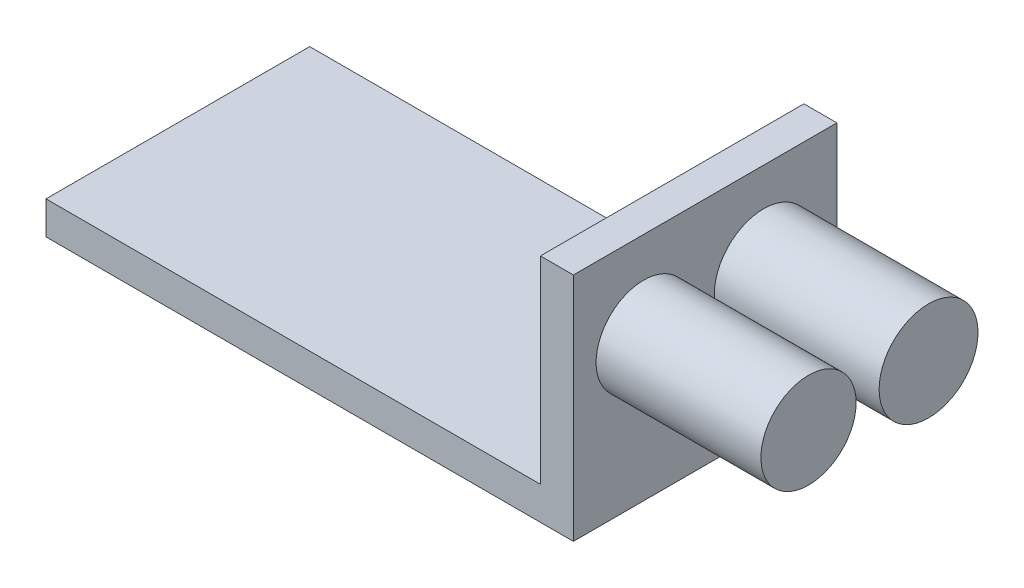
ISO-10303-21;
HEADER;
FILE_DESCRIPTION(('STEP AP214'),'2;1');
FILE_NAME('part.step','',(''),(''),'','','');
FILE_SCHEMA(('AUTOMOTIVE_DESIGN { 1 0 10303 214 1 1 1 1 }'));
ENDSEC;
DATA;
#1=APPLICATION_CONTEXT('core data for automotive mechanical design processes');
#2=APPLICATION_PROTOCOL_DEFINITION('international standard','automotive_design',2000,#1);
#3=PRODUCT_CONTEXT('',#1,'mechanical');
#4=PRODUCT('Part','Part','',(#3));
#5=PRODUCT_RELATED_PRODUCT_CATEGORY('part','',(#4));
#6=PRODUCT_DEFINITION_FORMATION('','',#4);
#7=PRODUCT_DEFINITION_CONTEXT('part definition',#1,'design');
#8=PRODUCT_DEFINITION('design','',#6,#7);
#9=PRODUCT_DEFINITION_SHAPE('','',#8);
#10=(LENGTH_UNIT() NAMED_UNIT(*) SI_UNIT(.MILLI.,.METRE.));
#11=(NAMED_UNIT(*) PLANE_ANGLE_UNIT() SI_UNIT($,.RADIAN.));
#12=(NAMED_UNIT(*) SI_UNIT($,.STERADIAN.) SOLID_ANGLE_UNIT());
#13=UNCERTAINTY_MEASURE_WITH_UNIT(LENGTH_MEASURE(1.E-05),#10,'distance_accuracy_value','');
#14=(GEOMETRIC_REPRESENTATION_CONTEXT(3) GLOBAL_UNCERTAINTY_ASSIGNED_CONTEXT((#13)) GLOBAL_UNIT_ASSIGNED_CONTEXT((#10,
#11,#12)) REPRESENTATION_CONTEXT('',''));
#15=CARTESIAN_POINT('',(0.,0.,0.));
#16=DIRECTION('',(0.,0.,1.));
#17=DIRECTION('',(1.,0.,0.));
#18=AXIS2_PLACEMENT_3D('',#15,#16,#17);
#19=CARTESIAN_POINT('',(7.5,1.,4.));
#20=DIRECTION('',(-1.,0.,0.));
#21=DIRECTION('',(0.,0.,1.));
#22=AXIS2_PLACEMENT_3D('',#19,#20,#21);
#23=PLANE('',#22);
#24=DIRECTION('',(0.,1.,0.));
#25=VECTOR('',#24,1.);
#26=CARTESIAN_POINT('',(7.5,0.,-3.99382905658285));
#27=LINE('',#26,#25);
#28=CARTESIAN_POINT('',(7.5,0.,-3.99382905658285));
#29=VERTEX_POINT('',#28);
#30=CARTESIAN_POINT('',(7.5,1.,-3.99382905658285));
#31=VERTEX_POINT('',#30);
#32=EDGE_CURVE('E47',#29,#31,#27,.T.);
#33=ORIENTED_EDGE('',*,*,#32,.F.);
#34=DIRECTION('',(0.,0.,-1.));
#35=VECTOR('',#34,1.);
#36=CARTESIAN_POINT('',(7.5,0.,4.));
#37=LINE('',#36,#35);
#38=CARTESIAN_POINT('',(7.5,0.,-4.));
#39=VERTEX_POINT('',#38);
#40=EDGE_CURVE('E114',#29,#39,#37,.T.);
#41=ORIENTED_EDGE('',*,*,#40,.T.);
#42=DIRECTION('',(0.,-1.,0.));
#43=VECTOR('',#42,1.);
#44=CARTESIAN_POINT('',(7.5,1.,-4.));
#45=LINE('',#44,#43);
#46=CARTESIAN_POINT('',(7.5,1.,-4.));
#47=VERTEX_POINT('',#46);
#48=EDGE_CURVE('E161',#47,#39,#45,.T.);
#49=ORIENTED_EDGE('',*,*,#48,.F.);
#50=DIRECTION('',(0.,0.,-1.));
#51=VECTOR('',#50,1.);
#52=CARTESIAN_POINT('',(7.5,1.,4.));
#53=LINE('',#52,#51);
#54=EDGE_CURVE('E152',#31,#47,#53,.T.);
#55=ORIENTED_EDGE('',*,*,#54,.F.);
#56=EDGE_LOOP('',(#33,#41,#49,#55));
#57=FACE_BOUND('',#56,.T.);
#58=ADVANCED_FACE('F32',(#57),#23,.F.);
#59=CARTESIAN_POINT('',(-7.5,1.,4.));
#60=DIRECTION('',(1.,0.,0.));
#61=DIRECTION('',(0.,0.,-1.));
#62=AXIS2_PLACEMENT_3D('',#59,#60,#61);
#63=PLANE('',#62);
#64=DIRECTION('',(0.,0.,1.));
#65=VECTOR('',#64,1.);
#66=CARTESIAN_POINT('',(-7.5,0.,4.));
#67=LINE('',#66,#65);
#68=CARTESIAN_POINT('',(-7.5,0.,-4.));
#69=VERTEX_POINT('',#68);
#70=CARTESIAN_POINT('',(-7.5,0.,4.));
#71=VERTEX_POINT('',#70);
#72=EDGE_CURVE('E115',#69,#71,#67,.T.);
#73=ORIENTED_EDGE('',*,*,#72,.T.);
#74=DIRECTION('',(0.,-1.,0.));
#75=VECTOR('',#74,1.);
#76=CARTESIAN_POINT('',(-7.5,1.,4.));
#77=LINE('',#76,#75);
#78=CARTESIAN_POINT('',(-7.5,1.,4.));
#79=VERTEX_POINT('',#78);
#80=EDGE_CURVE('E110',#79,#71,#77,.T.);
#81=ORIENTED_EDGE('',*,*,#80,.F.);
#82=DIRECTION('',(0.,0.,1.));
#83=VECTOR('',#82,1.);
#84=CARTESIAN_POINT('',(-7.5,1.,4.));
#85=LINE('',#84,#83);
#86=CARTESIAN_POINT('',(-7.5,1.,-4.));
#87=VERTEX_POINT('',#86);
#88=EDGE_CURVE('E149',#87,#79,#85,.T.);
#89=ORIENTED_EDGE('',*,*,#88,.F.);
#90=DIRECTION('',(0.,-1.,0.));
#91=VECTOR('',#90,1.);
#92=CARTESIAN_POINT('',(-7.5,1.,-4.));
#93=LINE('',#92,#91);
#94=EDGE_CURVE('E156',#87,#69,#93,.T.);
#95=ORIENTED_EDGE('',*,*,#94,.T.);
#96=EDGE_LOOP('',(#73,#81,#89,#95));
#97=FACE_BOUND('',#96,.T.);
#98=ADVANCED_FACE('F34',(#97),#63,.F.);
#99=CARTESIAN_POINT('',(7.5,1.,4.));
#100=DIRECTION('',(0.,0.,-1.));
#101=DIRECTION('',(-1.,0.,0.));
#102=AXIS2_PLACEMENT_3D('',#99,#100,#101);
#103=PLANE('',#102);
#104=DIRECTION('',(1.,0.,0.));
#105=VECTOR('',#104,1.);
#106=CARTESIAN_POINT('',(7.5,0.,4.));
#107=LINE('',#106,#105);
#108=CARTESIAN_POINT('',(8.5,0.,4.));
#109=VERTEX_POINT('',#108);
#110=EDGE_CURVE('E103',#71,#109,#107,.T.);
#111=ORIENTED_EDGE('',*,*,#110,.T.);
#112=DIRECTION('',(0.,-1.,0.));
#113=VECTOR('',#112,1.);
#114=CARTESIAN_POINT('',(8.5,0.,4.));
#115=LINE('',#114,#113);
#116=CARTESIAN_POINT('',(8.5,7.,4.));
#117=VERTEX_POINT('',#116);
#118=EDGE_CURVE('E108',#117,#109,#115,.T.);
#119=ORIENTED_EDGE('',*,*,#118,.F.);
#120=DIRECTION('',(-1.,0.,0.));
#121=VECTOR('',#120,1.);
#122=CARTESIAN_POINT('',(8.5,7.,4.));
#123=LINE('',#122,#121);
#124=CARTESIAN_POINT('',(7.5,7.,4.));
#125=VERTEX_POINT('',#124);
#126=EDGE_CURVE('E138',#117,#125,#123,.T.);
#127=ORIENTED_EDGE('',*,*,#126,.T.);
#128=DIRECTION('',(0.,-1.,0.));
#129=VECTOR('',#128,1.);
#130=CARTESIAN_POINT('',(7.5,0.,4.));
#131=LINE('',#130,#129);
#132=CARTESIAN_POINT('',(7.5,1.,4.));
#133=VERTEX_POINT('',#132);
#134=EDGE_CURVE('E139',#125,#133,#131,.T.);
#135=ORIENTED_EDGE('',*,*,#134,.T.);
#136=DIRECTION('',(1.,0.,0.));
#137=VECTOR('',#136,1.);
#138=CARTESIAN_POINT('',(7.5,1.,4.));
#139=LINE('',#138,#137);
#140=EDGE_CURVE('E81',#79,#133,#139,.T.);
#141=ORIENTED_EDGE('',*,*,#140,.F.);
#142=ORIENTED_EDGE('',*,*,#80,.T.);
#143=EDGE_LOOP('',(#111,#119,#127,#135,#141,#142));
#144=FACE_BOUND('',#143,.T.);
#145=ADVANCED_FACE('F105',(#144),#103,.F.);
#146=CARTESIAN_POINT('',(7.5,1.,-4.));
#147=DIRECTION('',(0.,0.,1.));
#148=DIRECTION('',(1.,0.,0.));
#149=AXIS2_PLACEMENT_3D('',#146,#147,#148);
#150=PLANE('',#149);
#151=DIRECTION('',(-1.,0.,0.));
#152=VECTOR('',#151,1.);
#153=CARTESIAN_POINT('',(7.5,0.,-4.));
#154=LINE('',#153,#152);
#155=EDGE_CURVE('E73',#39,#69,#154,.T.);
#156=ORIENTED_EDGE('',*,*,#155,.T.);
#157=ORIENTED_EDGE('',*,*,#94,.F.);
#158=DIRECTION('',(-1.,0.,0.));
#159=VECTOR('',#158,1.);
#160=CARTESIAN_POINT('',(7.5,1.,-4.));
#161=LINE('',#160,#159);
#162=EDGE_CURVE('E56',#47,#87,#161,.T.);
#163=ORIENTED_EDGE('',*,*,#162,.F.);
#164=ORIENTED_EDGE('',*,*,#48,.T.);
#165=EDGE_LOOP('',(#156,#157,#163,#164));
#166=FACE_BOUND('',#165,.T.);
#167=ADVANCED_FACE('F190',(#166),#150,.F.);
#168=CARTESIAN_POINT('',(0.,1.,0.));
#169=DIRECTION('',(0.,1.,0.));
#170=DIRECTION('',(0.,0.,1.));
#171=AXIS2_PLACEMENT_3D('',#168,#169,#170);
#172=PLANE('',#171);
#173=ORIENTED_EDGE('',*,*,#88,.T.);
#174=ORIENTED_EDGE('',*,*,#140,.T.);
#175=EDGE_CURVE('E153',#133,#31,#53,.T.);
#176=ORIENTED_EDGE('',*,*,#175,.T.);
#177=ORIENTED_EDGE('',*,*,#54,.T.);
#178=ORIENTED_EDGE('',*,*,#162,.T.);
#179=EDGE_LOOP('',(#173,#174,#176,#177,#178));
#180=FACE_BOUND('',#179,.T.);
#181=ADVANCED_FACE('F196',(#180),#172,.T.);
#182=CARTESIAN_POINT('',(0.,0.,0.));
#183=DIRECTION('',(0.,1.,0.));
#184=DIRECTION('',(0.,0.,1.));
#185=AXIS2_PLACEMENT_3D('',#182,#183,#184);
#186=PLANE('',#185);
#187=ORIENTED_EDGE('',*,*,#72,.F.);
#188=ORIENTED_EDGE('',*,*,#155,.F.);
#189=ORIENTED_EDGE('',*,*,#40,.F.);
#190=DIRECTION('',(-1.,0.,0.));
#191=VECTOR('',#190,1.);
#192=CARTESIAN_POINT('',(8.5,0.,-3.99382905658285));
#193=LINE('',#192,#191);
#194=CARTESIAN_POINT('',(8.5,0.,-3.99382905658285));
#195=VERTEX_POINT('',#194);
#196=EDGE_CURVE('E121',#195,#29,#193,.T.);
#197=ORIENTED_EDGE('',*,*,#196,.F.);
#198=DIRECTION('',(0.,0.,-1.));
#199=VECTOR('',#198,1.);
#200=CARTESIAN_POINT('',(8.5,0.,4.));
#201=LINE('',#200,#199);
#202=EDGE_CURVE('E118',#109,#195,#201,.T.);
#203=ORIENTED_EDGE('',*,*,#202,.F.);
#204=ORIENTED_EDGE('',*,*,#110,.F.);
#205=EDGE_LOOP('',(#187,#188,#189,#197,#203,#204));
#206=FACE_BOUND('',#205,.T.);
#207=ADVANCED_FACE('F119',(#206),#186,.F.);
#208=CARTESIAN_POINT('',(7.5,0.,0.));
#209=DIRECTION('',(-1.,0.,0.));
#210=DIRECTION('',(0.,0.,1.));
#211=AXIS2_PLACEMENT_3D('',#208,#209,#210);
#212=PLANE('',#211);
#213=ORIENTED_EDGE('',*,*,#175,.F.);
#214=ORIENTED_EDGE('',*,*,#134,.F.);
#215=DIRECTION('',(0.,0.,1.));
#216=VECTOR('',#215,1.);
#217=CARTESIAN_POINT('',(7.5,7.,4.));
#218=LINE('',#217,#216);
#219=CARTESIAN_POINT('',(7.5,7.,-3.99382905658285));
#220=VERTEX_POINT('',#219);
#221=EDGE_CURVE('E130',#220,#125,#218,.T.);
#222=ORIENTED_EDGE('',*,*,#221,.F.);
#223=EDGE_CURVE('E141',#31,#220,#27,.T.);
#224=ORIENTED_EDGE('',*,*,#223,.F.);
#225=EDGE_LOOP('',(#213,#214,#222,#224));
#226=FACE_BOUND('',#225,.T.);
#227=ADVANCED_FACE('F204',(#226),#212,.T.);
#228=CARTESIAN_POINT('',(8.5,0.,-3.99382905658285));
#229=DIRECTION('',(0.,0.,1.));
#230=DIRECTION('',(1.,0.,0.));
#231=AXIS2_PLACEMENT_3D('',#228,#229,#230);
#232=PLANE('',#231);
#233=ORIENTED_EDGE('',*,*,#32,.T.);
#234=ORIENTED_EDGE('',*,*,#223,.T.);
#235=DIRECTION('',(-1.,0.,0.));
#236=VECTOR('',#235,1.);
#237=CARTESIAN_POINT('',(8.5,7.,-3.99382905658285));
#238=LINE('',#237,#236);
#239=CARTESIAN_POINT('',(8.5,7.,-3.99382905658285));
#240=VERTEX_POINT('',#239);
#241=EDGE_CURVE('E145',#240,#220,#238,.T.);
#242=ORIENTED_EDGE('',*,*,#241,.F.);
#243=DIRECTION('',(0.,1.,0.));
#244=VECTOR('',#243,1.);
#245=CARTESIAN_POINT('',(8.5,0.,-3.99382905658285));
#246=LINE('',#245,#244);
#247=EDGE_CURVE('E124',#195,#240,#246,.T.);
#248=ORIENTED_EDGE('',*,*,#247,.F.);
#249=ORIENTED_EDGE('',*,*,#196,.T.);
#250=EDGE_LOOP('',(#233,#234,#242,#248,#249));
#251=FACE_BOUND('',#250,.T.);
#252=ADVANCED_FACE('F178',(#251),#232,.F.);
#253=CARTESIAN_POINT('',(8.5,7.,4.));
#254=DIRECTION('',(0.,-1.,0.));
#255=DIRECTION('',(0.,0.,-1.));
#256=AXIS2_PLACEMENT_3D('',#253,#254,#255);
#257=PLANE('',#256);
#258=ORIENTED_EDGE('',*,*,#221,.T.);
#259=ORIENTED_EDGE('',*,*,#126,.F.);
#260=DIRECTION('',(0.,0.,1.));
#261=VECTOR('',#260,1.);
#262=CARTESIAN_POINT('',(8.5,7.,4.));
#263=LINE('',#262,#261);
#264=EDGE_CURVE('E128',#240,#117,#263,.T.);
#265=ORIENTED_EDGE('',*,*,#264,.F.);
#266=ORIENTED_EDGE('',*,*,#241,.T.);
#267=EDGE_LOOP('',(#258,#259,#265,#266));
#268=FACE_BOUND('',#267,.T.);
#269=ADVANCED_FACE('F168',(#268),#257,.F.);
#270=CARTESIAN_POINT('',(8.5,0.,0.));
#271=DIRECTION('',(-1.,0.,0.));
#272=DIRECTION('',(0.,0.,1.));
#273=AXIS2_PLACEMENT_3D('',#270,#271,#272);
#274=PLANE('',#273);
#275=CARTESIAN_POINT('',(8.5,4.35473351396354,-1.77539933295634));
#276=DIRECTION('',(-1.,0.,0.));
#277=DIRECTION('',(0.,0.,1.));
#278=AXIS2_PLACEMENT_3D('',#275,#276,#277);
#279=CIRCLE('',#278,1.5);
#280=CARTESIAN_POINT('',(8.5,4.35473351396354,-0.27539933295634));
#281=VERTEX_POINT('',#280);
#282=EDGE_CURVE('E11',#281,#281,#279,.F.);
#283=ORIENTED_EDGE('',*,*,#282,.F.);
#284=EDGE_LOOP('',(#283));
#285=FACE_BOUND('',#284,.T.);
#286=CARTESIAN_POINT('',(8.5,4.35473351396354,1.8665761366492));
#287=DIRECTION('',(1.,0.,0.));
#288=DIRECTION('',(0.,0.,-1.));
#289=AXIS2_PLACEMENT_3D('',#286,#287,#288);
#290=CIRCLE('',#289,1.444324146935);
#291=CARTESIAN_POINT('',(8.5,4.35473351396354,0.4222519897142));
#292=VERTEX_POINT('',#291);
#293=EDGE_CURVE('E40',#292,#292,#290,.T.);
#294=ORIENTED_EDGE('',*,*,#293,.F.);
#295=EDGE_LOOP('',(#294));
#296=FACE_BOUND('',#295,.T.);
#297=ORIENTED_EDGE('',*,*,#118,.T.);
#298=ORIENTED_EDGE('',*,*,#202,.T.);
#299=ORIENTED_EDGE('',*,*,#247,.T.);
#300=ORIENTED_EDGE('',*,*,#264,.T.);
#301=EDGE_LOOP('',(#297,#298,#299,#300));
#302=FACE_BOUND('',#301,.T.);
#303=ADVANCED_FACE('F126',(#285,#296,#302),#274,.F.);
#304=CARTESIAN_POINT('',(13.5,4.35473351396354,1.8665761366492));
#305=DIRECTION('',(-1.,0.,0.));
#306=DIRECTION('',(0.,0.,1.));
#307=AXIS2_PLACEMENT_3D('',#304,#305,#306);
#308=CYLINDRICAL_SURFACE('',#307,1.444324146935);
#309=CARTESIAN_POINT('',(13.5,4.35473351396354,1.8665761366492));
#310=DIRECTION('',(1.,0.,0.));
#311=DIRECTION('',(0.,0.,-1.));
#312=AXIS2_PLACEMENT_3D('',#309,#310,#311);
#313=CIRCLE('',#312,1.444324146935);
#314=CARTESIAN_POINT('',(13.5,4.35473351396354,0.4222519897142));
#315=VERTEX_POINT('',#314);
#316=EDGE_CURVE('E142',#315,#315,#313,.T.);
#317=ORIENTED_EDGE('',*,*,#316,.F.);
#318=EDGE_LOOP('',(#317));
#319=FACE_BOUND('',#318,.T.);
#320=ORIENTED_EDGE('',*,*,#293,.T.);
#321=EDGE_LOOP('',(#320));
#322=FACE_BOUND('',#321,.T.);
#323=ADVANCED_FACE('F165',(#319,#322),#308,.T.);
#324=CARTESIAN_POINT('',(13.5,4.35473351396354,1.8665761366492));
#325=DIRECTION('',(1.,0.,0.));
#326=DIRECTION('',(0.,0.,-1.));
#327=AXIS2_PLACEMENT_3D('',#324,#325,#326);
#328=PLANE('',#327);
#329=ORIENTED_EDGE('',*,*,#316,.T.);
#330=EDGE_LOOP('',(#329));
#331=FACE_BOUND('',#330,.T.);
#332=ADVANCED_FACE('F175',(#331),#328,.T.);
#333=CARTESIAN_POINT('',(13.5,4.35473351396354,-1.77539933295634));
#334=DIRECTION('',(-1.,0.,0.));
#335=DIRECTION('',(0.,0.,1.));
#336=AXIS2_PLACEMENT_3D('',#333,#334,#335);
#337=CYLINDRICAL_SURFACE('',#336,1.5);
#338=CARTESIAN_POINT('',(13.5,4.35473351396354,-1.77539933295634));
#339=DIRECTION('',(1.,0.,0.));
#340=DIRECTION('',(0.,0.,-1.));
#341=AXIS2_PLACEMENT_3D('',#338,#339,#340);
#342=CIRCLE('',#341,1.5);
#343=CARTESIAN_POINT('',(13.5,4.35473351396354,-3.27539933295634));
#344=VERTEX_POINT('',#343);
#345=EDGE_CURVE('E274',#344,#344,#342,.T.);
#346=ORIENTED_EDGE('',*,*,#345,.F.);
#347=EDGE_LOOP('',(#346));
#348=FACE_BOUND('',#347,.T.);
#349=ORIENTED_EDGE('',*,*,#282,.T.);
#350=EDGE_LOOP('',(#349));
#351=FACE_BOUND('',#350,.T.);
#352=ADVANCED_FACE('F248',(#348,#351),#337,.T.);
#353=CARTESIAN_POINT('',(13.5,4.35473351396354,-1.77539933295634));
#354=DIRECTION('',(1.,0.,0.));
#355=DIRECTION('',(0.,0.,-1.));
#356=AXIS2_PLACEMENT_3D('',#353,#354,#355);
#357=PLANE('',#356);
#358=ORIENTED_EDGE('',*,*,#345,.T.);
#359=EDGE_LOOP('',(#358));
#360=FACE_BOUND('',#359,.T.);
#361=ADVANCED_FACE('F258',(#360),#357,.T.);
#362=CLOSED_SHELL('',(#58,#98,#145,#167,#181,#207,#227,#252,#269,#303,#323,#332,#352,#361));
#363=MANIFOLD_SOLID_BREP('B2',#362);
#364=ADVANCED_BREP_SHAPE_REPRESENTATION('',(#18,#363),#14);
#365=SHAPE_DEFINITION_REPRESENTATION(#9,#364);
ENDSEC;
END-ISO-10303-21;
